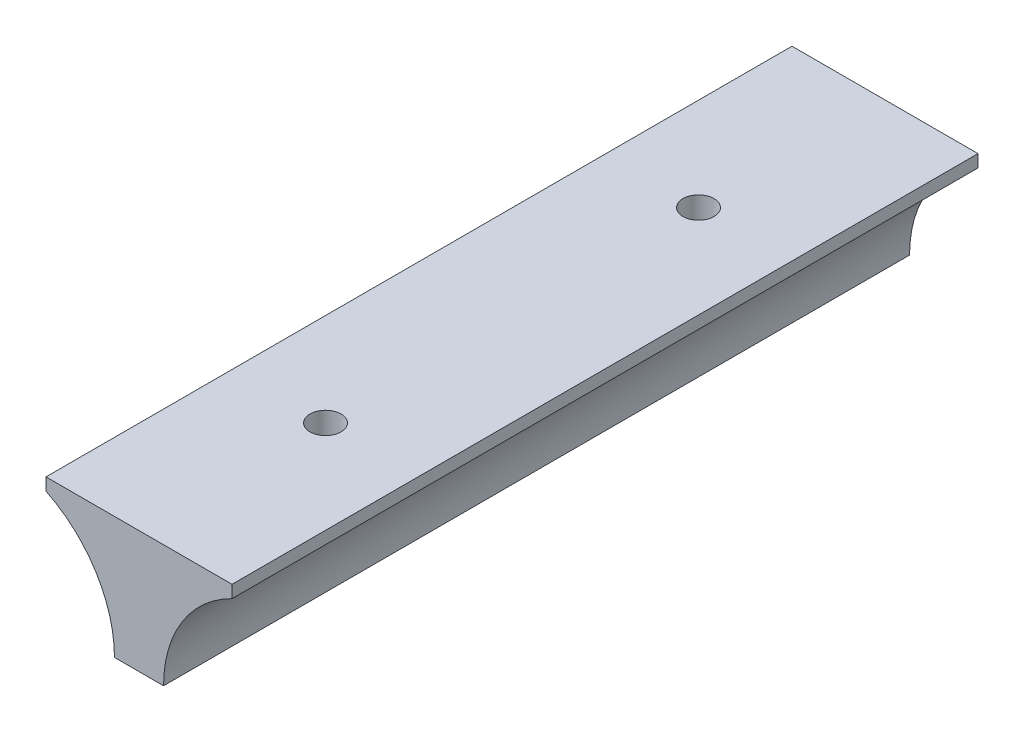
ISO-10303-21;
HEADER;
FILE_DESCRIPTION(('STEP AP214'),'2;1');
FILE_NAME('part.step','',(''),(''),'','','');
FILE_SCHEMA(('AUTOMOTIVE_DESIGN { 1 0 10303 214 1 1 1 1 }'));
ENDSEC;
DATA;
#1=APPLICATION_CONTEXT('core data for automotive mechanical design processes');
#2=APPLICATION_PROTOCOL_DEFINITION('international standard','automotive_design',2000,#1);
#3=PRODUCT_CONTEXT('',#1,'mechanical');
#4=PRODUCT('Part','Part','',(#3));
#5=PRODUCT_RELATED_PRODUCT_CATEGORY('part','',(#4));
#6=PRODUCT_DEFINITION_FORMATION('','',#4);
#7=PRODUCT_DEFINITION_CONTEXT('part definition',#1,'design');
#8=PRODUCT_DEFINITION('design','',#6,#7);
#9=PRODUCT_DEFINITION_SHAPE('','',#8);
#10=(LENGTH_UNIT() NAMED_UNIT(*) SI_UNIT(.MILLI.,.METRE.));
#11=(NAMED_UNIT(*) PLANE_ANGLE_UNIT() SI_UNIT($,.RADIAN.));
#12=(NAMED_UNIT(*) SI_UNIT($,.STERADIAN.) SOLID_ANGLE_UNIT());
#13=UNCERTAINTY_MEASURE_WITH_UNIT(LENGTH_MEASURE(1.E-05),#10,'distance_accuracy_value','');
#14=(GEOMETRIC_REPRESENTATION_CONTEXT(3) GLOBAL_UNCERTAINTY_ASSIGNED_CONTEXT((#13)) GLOBAL_UNIT_ASSIGNED_CONTEXT((#10,
#11,#12)) REPRESENTATION_CONTEXT('',''));
#15=CARTESIAN_POINT('',(0.,0.,0.));
#16=DIRECTION('',(0.,0.,1.));
#17=DIRECTION('',(1.,0.,0.));
#18=AXIS2_PLACEMENT_3D('',#15,#16,#17);
#19=CARTESIAN_POINT('',(7.48143542366216,9.825,60.));
#20=DIRECTION('',(0.,-1.,0.));
#21=DIRECTION('',(0.,0.,-1.));
#22=AXIS2_PLACEMENT_3D('',#19,#20,#21);
#23=PLANE('',#22);
#24=CARTESIAN_POINT('',(0.,9.825,15.));
#25=DIRECTION('',(0.,1.,0.));
#26=DIRECTION('',(0.,0.,1.));
#27=AXIS2_PLACEMENT_3D('',#24,#25,#26);
#28=CIRCLE('',#27,1.25);
#29=CARTESIAN_POINT('',(0.,9.825,16.25));
#30=VERTEX_POINT('',#29);
#31=EDGE_CURVE('E195',#30,#30,#28,.T.);
#32=ORIENTED_EDGE('',*,*,#31,.F.);
#33=EDGE_LOOP('',(#32));
#34=FACE_BOUND('',#33,.T.);
#35=DIRECTION('',(-1.,0.,0.));
#36=VECTOR('',#35,1.);
#37=CARTESIAN_POINT('',(7.48143542366216,9.825,0.));
#38=LINE('',#37,#36);
#39=CARTESIAN_POINT('',(7.48143542366216,9.825,0.));
#40=VERTEX_POINT('',#39);
#41=CARTESIAN_POINT('',(-7.48143542366216,9.825,0.));
#42=VERTEX_POINT('',#41);
#43=EDGE_CURVE('E80',#40,#42,#38,.T.);
#44=ORIENTED_EDGE('',*,*,#43,.T.);
#45=DIRECTION('',(0.,0.,-1.));
#46=VECTOR('',#45,1.);
#47=CARTESIAN_POINT('',(-7.48143542366216,9.825,60.));
#48=LINE('',#47,#46);
#49=CARTESIAN_POINT('',(-7.48143542366216,9.825,60.));
#50=VERTEX_POINT('',#49);
#51=EDGE_CURVE('E119',#50,#42,#48,.T.);
#52=ORIENTED_EDGE('',*,*,#51,.F.);
#53=DIRECTION('',(-1.,0.,0.));
#54=VECTOR('',#53,1.);
#55=CARTESIAN_POINT('',(7.48143542366216,9.825,60.));
#56=LINE('',#55,#54);
#57=CARTESIAN_POINT('',(7.48143542366216,9.825,60.));
#58=VERTEX_POINT('',#57);
#59=EDGE_CURVE('E105',#58,#50,#56,.T.);
#60=ORIENTED_EDGE('',*,*,#59,.F.);
#61=DIRECTION('',(0.,0.,-1.));
#62=VECTOR('',#61,1.);
#63=CARTESIAN_POINT('',(7.48143542366216,9.825,60.));
#64=LINE('',#63,#62);
#65=EDGE_CURVE('E113',#58,#40,#64,.T.);
#66=ORIENTED_EDGE('',*,*,#65,.T.);
#67=EDGE_LOOP('',(#44,#52,#60,#66));
#68=FACE_BOUND('',#67,.T.);
#69=CARTESIAN_POINT('',(0.,9.825,45.));
#70=DIRECTION('',(0.,1.,0.));
#71=DIRECTION('',(0.,0.,1.));
#72=AXIS2_PLACEMENT_3D('',#69,#70,#71);
#73=CIRCLE('',#72,1.25);
#74=CARTESIAN_POINT('',(0.,9.825,46.25));
#75=VERTEX_POINT('',#74);
#76=EDGE_CURVE('E208',#75,#75,#73,.T.);
#77=ORIENTED_EDGE('',*,*,#76,.F.);
#78=EDGE_LOOP('',(#77));
#79=FACE_BOUND('',#78,.T.);
#80=ADVANCED_FACE('F39',(#34,#68,#79),#23,.F.);
#81=CARTESIAN_POINT('',(-11.8,0.,60.));
#82=DIRECTION('',(0.,0.,-1.));
#83=DIRECTION('',(-1.,0.,0.));
#84=AXIS2_PLACEMENT_3D('',#81,#82,#83);
#85=CYLINDRICAL_SURFACE('',#84,9.825);
#86=CARTESIAN_POINT('',(-11.8,0.,0.));
#87=DIRECTION('',(0.,0.,-1.));
#88=DIRECTION('',(1.,0.,0.));
#89=AXIS2_PLACEMENT_3D('',#86,#87,#88);
#90=CIRCLE('',#89,9.825);
#91=CARTESIAN_POINT('',(-7.48143542366216,8.825,0.));
#92=VERTEX_POINT('',#91);
#93=CARTESIAN_POINT('',(-1.975,0.,0.));
#94=VERTEX_POINT('',#93);
#95=EDGE_CURVE('E129',#92,#94,#90,.T.);
#96=ORIENTED_EDGE('',*,*,#95,.T.);
#97=DIRECTION('',(0.,0.,-1.));
#98=VECTOR('',#97,1.);
#99=CARTESIAN_POINT('',(-1.975,0.,60.));
#100=LINE('',#99,#98);
#101=CARTESIAN_POINT('',(-1.975,0.,60.));
#102=VERTEX_POINT('',#101);
#103=EDGE_CURVE('E11',#102,#94,#100,.T.);
#104=ORIENTED_EDGE('',*,*,#103,.F.);
#105=CARTESIAN_POINT('',(-11.8,0.,60.));
#106=DIRECTION('',(0.,0.,-1.));
#107=DIRECTION('',(1.,0.,0.));
#108=AXIS2_PLACEMENT_3D('',#105,#106,#107);
#109=CIRCLE('',#108,9.825);
#110=CARTESIAN_POINT('',(-7.48143542366216,8.825,60.));
#111=VERTEX_POINT('',#110);
#112=EDGE_CURVE('E146',#111,#102,#109,.T.);
#113=ORIENTED_EDGE('',*,*,#112,.F.);
#114=DIRECTION('',(0.,0.,-1.));
#115=VECTOR('',#114,1.);
#116=CARTESIAN_POINT('',(-7.48143542366216,8.825,60.));
#117=LINE('',#116,#115);
#118=EDGE_CURVE('E125',#111,#92,#117,.T.);
#119=ORIENTED_EDGE('',*,*,#118,.T.);
#120=EDGE_LOOP('',(#96,#104,#113,#119));
#121=FACE_BOUND('',#120,.T.);
#122=ADVANCED_FACE('F41',(#121),#85,.F.);
#123=CARTESIAN_POINT('',(-1.975,0.,60.));
#124=DIRECTION('',(0.,1.,0.));
#125=DIRECTION('',(-1.,0.,0.));
#126=AXIS2_PLACEMENT_3D('',#123,#124,#125);
#127=PLANE('',#126);
#128=CARTESIAN_POINT('',(0.,0.,45.));
#129=DIRECTION('',(0.,1.,0.));
#130=DIRECTION('',(-1.,0.,0.));
#131=AXIS2_PLACEMENT_3D('',#128,#129,#130);
#132=CIRCLE('',#131,1.25);
#133=CARTESIAN_POINT('',(-1.25,0.,45.));
#134=VERTEX_POINT('',#133);
#135=EDGE_CURVE('E190',#134,#134,#132,.T.);
#136=ORIENTED_EDGE('',*,*,#135,.T.);
#137=EDGE_LOOP('',(#136));
#138=FACE_BOUND('',#137,.T.);
#139=CARTESIAN_POINT('',(0.,0.,15.));
#140=DIRECTION('',(0.,1.,0.));
#141=DIRECTION('',(-1.,0.,0.));
#142=AXIS2_PLACEMENT_3D('',#139,#140,#141);
#143=CIRCLE('',#142,1.25);
#144=CARTESIAN_POINT('',(-1.25,0.,15.));
#145=VERTEX_POINT('',#144);
#146=EDGE_CURVE('E134',#145,#145,#143,.T.);
#147=ORIENTED_EDGE('',*,*,#146,.T.);
#148=EDGE_LOOP('',(#147));
#149=FACE_BOUND('',#148,.T.);
#150=DIRECTION('',(1.,0.,0.));
#151=VECTOR('',#150,1.);
#152=CARTESIAN_POINT('',(-1.975,0.,0.));
#153=LINE('',#152,#151);
#154=CARTESIAN_POINT('',(1.975,0.,0.));
#155=VERTEX_POINT('',#154);
#156=EDGE_CURVE('E133',#94,#155,#153,.T.);
#157=ORIENTED_EDGE('',*,*,#156,.T.);
#158=DIRECTION('',(0.,0.,-1.));
#159=VECTOR('',#158,1.);
#160=CARTESIAN_POINT('',(1.975,0.,60.));
#161=LINE('',#160,#159);
#162=CARTESIAN_POINT('',(1.975,0.,60.));
#163=VERTEX_POINT('',#162);
#164=EDGE_CURVE('E49',#163,#155,#161,.T.);
#165=ORIENTED_EDGE('',*,*,#164,.F.);
#166=DIRECTION('',(1.,0.,0.));
#167=VECTOR('',#166,1.);
#168=CARTESIAN_POINT('',(-1.975,0.,60.));
#169=LINE('',#168,#167);
#170=EDGE_CURVE('E94',#102,#163,#169,.T.);
#171=ORIENTED_EDGE('',*,*,#170,.F.);
#172=ORIENTED_EDGE('',*,*,#103,.T.);
#173=EDGE_LOOP('',(#157,#165,#171,#172));
#174=FACE_BOUND('',#173,.T.);
#175=ADVANCED_FACE('F179',(#138,#149,#174),#127,.F.);
#176=CARTESIAN_POINT('',(11.8,0.,60.));
#177=DIRECTION('',(0.,0.,-1.));
#178=DIRECTION('',(-1.,0.,0.));
#179=AXIS2_PLACEMENT_3D('',#176,#177,#178);
#180=CYLINDRICAL_SURFACE('',#179,9.825);
#181=CARTESIAN_POINT('',(11.8,0.,0.));
#182=DIRECTION('',(0.,0.,-1.));
#183=DIRECTION('',(-1.,0.,0.));
#184=AXIS2_PLACEMENT_3D('',#181,#182,#183);
#185=CIRCLE('',#184,9.825);
#186=CARTESIAN_POINT('',(7.48143542366216,8.825,0.));
#187=VERTEX_POINT('',#186);
#188=EDGE_CURVE('E137',#155,#187,#185,.T.);
#189=ORIENTED_EDGE('',*,*,#188,.T.);
#190=DIRECTION('',(0.,0.,-1.));
#191=VECTOR('',#190,1.);
#192=CARTESIAN_POINT('',(7.48143542366216,8.825,60.));
#193=LINE('',#192,#191);
#194=CARTESIAN_POINT('',(7.48143542366216,8.825,60.));
#195=VERTEX_POINT('',#194);
#196=EDGE_CURVE('E118',#195,#187,#193,.T.);
#197=ORIENTED_EDGE('',*,*,#196,.F.);
#198=CARTESIAN_POINT('',(11.8,0.,60.));
#199=DIRECTION('',(0.,0.,-1.));
#200=DIRECTION('',(-1.,0.,0.));
#201=AXIS2_PLACEMENT_3D('',#198,#199,#200);
#202=CIRCLE('',#201,9.825);
#203=EDGE_CURVE('E107',#163,#195,#202,.T.);
#204=ORIENTED_EDGE('',*,*,#203,.F.);
#205=ORIENTED_EDGE('',*,*,#164,.T.);
#206=EDGE_LOOP('',(#189,#197,#204,#205));
#207=FACE_BOUND('',#206,.T.);
#208=ADVANCED_FACE('F156',(#207),#180,.F.);
#209=CARTESIAN_POINT('',(7.48143542366216,8.825,60.));
#210=DIRECTION('',(-1.,0.,0.));
#211=DIRECTION('',(0.,0.,1.));
#212=AXIS2_PLACEMENT_3D('',#209,#210,#211);
#213=PLANE('',#212);
#214=DIRECTION('',(0.,1.,0.));
#215=VECTOR('',#214,1.);
#216=CARTESIAN_POINT('',(7.48143542366216,8.825,0.));
#217=LINE('',#216,#215);
#218=EDGE_CURVE('E116',#187,#40,#217,.T.);
#219=ORIENTED_EDGE('',*,*,#218,.T.);
#220=ORIENTED_EDGE('',*,*,#65,.F.);
#221=DIRECTION('',(0.,1.,0.));
#222=VECTOR('',#221,1.);
#223=CARTESIAN_POINT('',(7.48143542366216,8.825,60.));
#224=LINE('',#223,#222);
#225=EDGE_CURVE('E101',#195,#58,#224,.T.);
#226=ORIENTED_EDGE('',*,*,#225,.F.);
#227=ORIENTED_EDGE('',*,*,#196,.T.);
#228=EDGE_LOOP('',(#219,#220,#226,#227));
#229=FACE_BOUND('',#228,.T.);
#230=ADVANCED_FACE('F114',(#229),#213,.F.);
#231=CARTESIAN_POINT('',(-7.48143542366216,9.825,60.));
#232=DIRECTION('',(1.,0.,0.));
#233=DIRECTION('',(0.,0.,-1.));
#234=AXIS2_PLACEMENT_3D('',#231,#232,#233);
#235=PLANE('',#234);
#236=DIRECTION('',(0.,-1.,0.));
#237=VECTOR('',#236,1.);
#238=CARTESIAN_POINT('',(-7.48143542366216,9.825,0.));
#239=LINE('',#238,#237);
#240=EDGE_CURVE('E86',#42,#92,#239,.T.);
#241=ORIENTED_EDGE('',*,*,#240,.T.);
#242=ORIENTED_EDGE('',*,*,#118,.F.);
#243=DIRECTION('',(0.,-1.,0.));
#244=VECTOR('',#243,1.);
#245=CARTESIAN_POINT('',(-7.48143542366216,9.825,60.));
#246=LINE('',#245,#244);
#247=EDGE_CURVE('E57',#50,#111,#246,.T.);
#248=ORIENTED_EDGE('',*,*,#247,.F.);
#249=ORIENTED_EDGE('',*,*,#51,.T.);
#250=EDGE_LOOP('',(#241,#242,#248,#249));
#251=FACE_BOUND('',#250,.T.);
#252=ADVANCED_FACE('F163',(#251),#235,.F.);
#253=CARTESIAN_POINT('',(-11.8,0.,60.));
#254=DIRECTION('',(0.,0.,1.));
#255=DIRECTION('',(1.,0.,0.));
#256=AXIS2_PLACEMENT_3D('',#253,#254,#255);
#257=PLANE('',#256);
#258=ORIENTED_EDGE('',*,*,#112,.T.);
#259=ORIENTED_EDGE('',*,*,#170,.T.);
#260=ORIENTED_EDGE('',*,*,#203,.T.);
#261=ORIENTED_EDGE('',*,*,#225,.T.);
#262=ORIENTED_EDGE('',*,*,#59,.T.);
#263=ORIENTED_EDGE('',*,*,#247,.T.);
#264=EDGE_LOOP('',(#258,#259,#260,#261,#262,#263));
#265=FACE_BOUND('',#264,.T.);
#266=ADVANCED_FACE('F103',(#265),#257,.T.);
#267=CARTESIAN_POINT('',(-11.8,0.,0.));
#268=DIRECTION('',(0.,0.,1.));
#269=DIRECTION('',(1.,0.,0.));
#270=AXIS2_PLACEMENT_3D('',#267,#268,#269);
#271=PLANE('',#270);
#272=ORIENTED_EDGE('',*,*,#95,.F.);
#273=ORIENTED_EDGE('',*,*,#240,.F.);
#274=ORIENTED_EDGE('',*,*,#43,.F.);
#275=ORIENTED_EDGE('',*,*,#218,.F.);
#276=ORIENTED_EDGE('',*,*,#188,.F.);
#277=ORIENTED_EDGE('',*,*,#156,.F.);
#278=EDGE_LOOP('',(#272,#273,#274,#275,#276,#277));
#279=FACE_BOUND('',#278,.T.);
#280=ADVANCED_FACE('F159',(#279),#271,.F.);
#281=CARTESIAN_POINT('',(0.,9.825,15.));
#282=DIRECTION('',(0.,1.,0.));
#283=DIRECTION('',(0.,0.,1.));
#284=AXIS2_PLACEMENT_3D('',#281,#282,#283);
#285=CYLINDRICAL_SURFACE('',#284,1.25);
#286=ORIENTED_EDGE('',*,*,#146,.F.);
#287=EDGE_LOOP('',(#286));
#288=FACE_BOUND('',#287,.T.);
#289=ORIENTED_EDGE('',*,*,#31,.T.);
#290=EDGE_LOOP('',(#289));
#291=FACE_BOUND('',#290,.T.);
#292=ADVANCED_FACE('F215',(#288,#291),#285,.F.);
#293=CARTESIAN_POINT('',(0.,9.825,45.));
#294=DIRECTION('',(0.,1.,0.));
#295=DIRECTION('',(0.,0.,1.));
#296=AXIS2_PLACEMENT_3D('',#293,#294,#295);
#297=CYLINDRICAL_SURFACE('',#296,1.25);
#298=ORIENTED_EDGE('',*,*,#135,.F.);
#299=EDGE_LOOP('',(#298));
#300=FACE_BOUND('',#299,.T.);
#301=ORIENTED_EDGE('',*,*,#76,.T.);
#302=EDGE_LOOP('',(#301));
#303=FACE_BOUND('',#302,.T.);
#304=ADVANCED_FACE('F213',(#300,#303),#297,.F.);
#305=CLOSED_SHELL('',(#80,#122,#175,#208,#230,#252,#266,#280,#292,#304));
#306=MANIFOLD_SOLID_BREP('B2',#305);
#307=ADVANCED_BREP_SHAPE_REPRESENTATION('',(#18,#306),#14);
#308=SHAPE_DEFINITION_REPRESENTATION(#9,#307);
ENDSEC;
END-ISO-10303-21;
